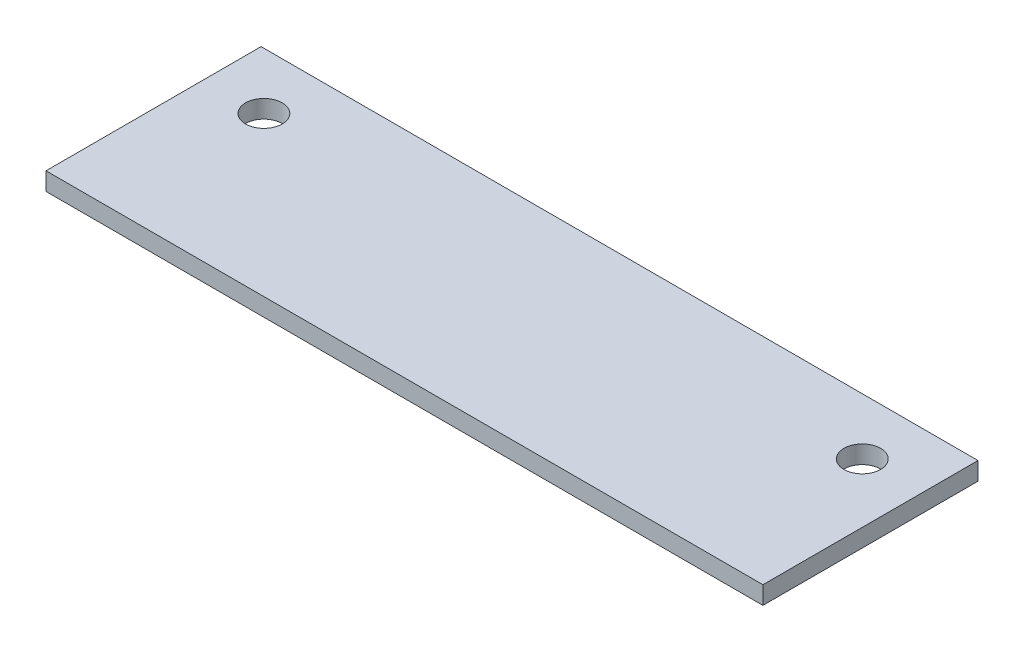
ISO-10303-21;
HEADER;
FILE_DESCRIPTION(('STEP AP214'),'2;1');
FILE_NAME('part.step','',(''),(''),'','','');
FILE_SCHEMA(('AUTOMOTIVE_DESIGN { 1 0 10303 214 1 1 1 1 }'));
ENDSEC;
DATA;
#1=APPLICATION_CONTEXT('core data for automotive mechanical design processes');
#2=APPLICATION_PROTOCOL_DEFINITION('international standard','automotive_design',2000,#1);
#3=PRODUCT_CONTEXT('',#1,'mechanical');
#4=PRODUCT('Part','Part','',(#3));
#5=PRODUCT_RELATED_PRODUCT_CATEGORY('part','',(#4));
#6=PRODUCT_DEFINITION_FORMATION('','',#4);
#7=PRODUCT_DEFINITION_CONTEXT('part definition',#1,'design');
#8=PRODUCT_DEFINITION('design','',#6,#7);
#9=PRODUCT_DEFINITION_SHAPE('','',#8);
#10=(LENGTH_UNIT() NAMED_UNIT(*) SI_UNIT(.MILLI.,.METRE.));
#11=(NAMED_UNIT(*) PLANE_ANGLE_UNIT() SI_UNIT($,.RADIAN.));
#12=(NAMED_UNIT(*) SI_UNIT($,.STERADIAN.) SOLID_ANGLE_UNIT());
#13=UNCERTAINTY_MEASURE_WITH_UNIT(LENGTH_MEASURE(1.E-05),#10,'distance_accuracy_value','');
#14=(GEOMETRIC_REPRESENTATION_CONTEXT(3) GLOBAL_UNCERTAINTY_ASSIGNED_CONTEXT((#13)) GLOBAL_UNIT_ASSIGNED_CONTEXT((#10,
#11,#12)) REPRESENTATION_CONTEXT('',''));
#15=CARTESIAN_POINT('',(0.,0.,0.));
#16=DIRECTION('',(0.,0.,1.));
#17=DIRECTION('',(1.,0.,0.));
#18=AXIS2_PLACEMENT_3D('',#15,#16,#17);
#19=CARTESIAN_POINT('',(-63.5,3.175,38.1));
#20=DIRECTION('',(-1.,0.,0.));
#21=DIRECTION('',(0.,0.,1.));
#22=AXIS2_PLACEMENT_3D('',#19,#20,#21);
#23=PLANE('',#22);
#24=DIRECTION('',(0.,1.,0.));
#25=VECTOR('',#24,1.);
#26=CARTESIAN_POINT('',(-63.5,0.,0.));
#27=LINE('',#26,#25);
#28=CARTESIAN_POINT('',(-63.5,0.,0.));
#29=VERTEX_POINT('',#28);
#30=CARTESIAN_POINT('',(-63.5,3.175,0.));
#31=VERTEX_POINT('',#30);
#32=EDGE_CURVE('E48',#29,#31,#27,.T.);
#33=ORIENTED_EDGE('',*,*,#32,.T.);
#34=DIRECTION('',(0.,0.,-1.));
#35=VECTOR('',#34,1.);
#36=CARTESIAN_POINT('',(-63.5,3.175,38.1));
#37=LINE('',#36,#35);
#38=CARTESIAN_POINT('',(-63.5,3.175,-38.1));
#39=VERTEX_POINT('',#38);
#40=EDGE_CURVE('E78',#31,#39,#37,.T.);
#41=ORIENTED_EDGE('',*,*,#40,.T.);
#42=DIRECTION('',(0.,-1.,0.));
#43=VECTOR('',#42,1.);
#44=CARTESIAN_POINT('',(-63.5,3.175,-38.1));
#45=LINE('',#44,#43);
#46=CARTESIAN_POINT('',(-63.5,0.,-38.1));
#47=VERTEX_POINT('',#46);
#48=EDGE_CURVE('E37',#39,#47,#45,.T.);
#49=ORIENTED_EDGE('',*,*,#48,.T.);
#50=DIRECTION('',(0.,0.,-1.));
#51=VECTOR('',#50,1.);
#52=CARTESIAN_POINT('',(-63.5,0.,38.1));
#53=LINE('',#52,#51);
#54=EDGE_CURVE('E89',#29,#47,#53,.T.);
#55=ORIENTED_EDGE('',*,*,#54,.F.);
#56=EDGE_LOOP('',(#33,#41,#49,#55));
#57=FACE_BOUND('',#56,.T.);
#58=ADVANCED_FACE('F34',(#57),#23,.T.);
#59=CARTESIAN_POINT('',(63.5,3.175,38.1));
#60=DIRECTION('',(-1.,0.,0.));
#61=DIRECTION('',(0.,0.,1.));
#62=AXIS2_PLACEMENT_3D('',#59,#60,#61);
#63=PLANE('',#62);
#64=DIRECTION('',(0.,0.,-1.));
#65=VECTOR('',#64,1.);
#66=CARTESIAN_POINT('',(63.5,3.175,38.1));
#67=LINE('',#66,#65);
#68=CARTESIAN_POINT('',(63.5,3.175,0.));
#69=VERTEX_POINT('',#68);
#70=CARTESIAN_POINT('',(63.5,3.175,-38.1));
#71=VERTEX_POINT('',#70);
#72=EDGE_CURVE('E57',#69,#71,#67,.T.);
#73=ORIENTED_EDGE('',*,*,#72,.F.);
#74=DIRECTION('',(0.,1.,0.));
#75=VECTOR('',#74,1.);
#76=CARTESIAN_POINT('',(63.5,0.,0.));
#77=LINE('',#76,#75);
#78=CARTESIAN_POINT('',(63.5,0.,0.));
#79=VERTEX_POINT('',#78);
#80=EDGE_CURVE('E75',#79,#69,#77,.T.);
#81=ORIENTED_EDGE('',*,*,#80,.F.);
#82=DIRECTION('',(0.,0.,-1.));
#83=VECTOR('',#82,1.);
#84=CARTESIAN_POINT('',(63.5,0.,38.1));
#85=LINE('',#84,#83);
#86=CARTESIAN_POINT('',(63.5,0.,-38.1));
#87=VERTEX_POINT('',#86);
#88=EDGE_CURVE('E71',#79,#87,#85,.T.);
#89=ORIENTED_EDGE('',*,*,#88,.T.);
#90=DIRECTION('',(0.,-1.,0.));
#91=VECTOR('',#90,1.);
#92=CARTESIAN_POINT('',(63.5,3.175,-38.1));
#93=LINE('',#92,#91);
#94=EDGE_CURVE('E11',#71,#87,#93,.T.);
#95=ORIENTED_EDGE('',*,*,#94,.F.);
#96=EDGE_LOOP('',(#73,#81,#89,#95));
#97=FACE_BOUND('',#96,.T.);
#98=ADVANCED_FACE('F72',(#97),#63,.F.);
#99=CARTESIAN_POINT('',(-63.5,3.175,-38.1));
#100=DIRECTION('',(0.,0.,-1.));
#101=DIRECTION('',(-1.,0.,0.));
#102=AXIS2_PLACEMENT_3D('',#99,#100,#101);
#103=PLANE('',#102);
#104=DIRECTION('',(1.,0.,0.));
#105=VECTOR('',#104,1.);
#106=CARTESIAN_POINT('',(-63.5,0.,-38.1));
#107=LINE('',#106,#105);
#108=EDGE_CURVE('E79',#47,#87,#107,.T.);
#109=ORIENTED_EDGE('',*,*,#108,.F.);
#110=ORIENTED_EDGE('',*,*,#48,.F.);
#111=DIRECTION('',(1.,0.,0.));
#112=VECTOR('',#111,1.);
#113=CARTESIAN_POINT('',(-63.5,3.175,-38.1));
#114=LINE('',#113,#112);
#115=EDGE_CURVE('E85',#39,#71,#114,.T.);
#116=ORIENTED_EDGE('',*,*,#115,.T.);
#117=ORIENTED_EDGE('',*,*,#94,.T.);
#118=EDGE_LOOP('',(#109,#110,#116,#117));
#119=FACE_BOUND('',#118,.T.);
#120=ADVANCED_FACE('F83',(#119),#103,.T.);
#121=CARTESIAN_POINT('',(0.,3.175,0.));
#122=DIRECTION('',(0.,-1.,0.));
#123=DIRECTION('',(0.,0.,-1.));
#124=AXIS2_PLACEMENT_3D('',#121,#122,#123);
#125=PLANE('',#124);
#126=CARTESIAN_POINT('',(-53.,3.175,-28.1));
#127=DIRECTION('',(0.,1.,0.));
#128=DIRECTION('',(0.,0.,1.));
#129=AXIS2_PLACEMENT_3D('',#126,#127,#128);
#130=CIRCLE('',#129,3.24999999999995);
#131=CARTESIAN_POINT('',(-53.,3.175,-24.85));
#132=VERTEX_POINT('',#131);
#133=EDGE_CURVE('E103',#132,#132,#130,.T.);
#134=ORIENTED_EDGE('',*,*,#133,.F.);
#135=EDGE_LOOP('',(#134));
#136=FACE_BOUND('',#135,.T.);
#137=CARTESIAN_POINT('',(53.0000000000001,3.175,-28.1));
#138=DIRECTION('',(0.,1.,0.));
#139=DIRECTION('',(0.,0.,1.));
#140=AXIS2_PLACEMENT_3D('',#137,#138,#139);
#141=CIRCLE('',#140,3.24999999999995);
#142=CARTESIAN_POINT('',(53.0000000000001,3.175,-24.85));
#143=VERTEX_POINT('',#142);
#144=EDGE_CURVE('E97',#143,#143,#141,.T.);
#145=ORIENTED_EDGE('',*,*,#144,.F.);
#146=EDGE_LOOP('',(#145));
#147=FACE_BOUND('',#146,.T.);
#148=ORIENTED_EDGE('',*,*,#40,.F.);
#149=DIRECTION('',(-1.,0.,0.));
#150=VECTOR('',#149,1.);
#151=CARTESIAN_POINT('',(0.,3.175,0.));
#152=LINE('',#151,#150);
#153=EDGE_CURVE('E109',#69,#31,#152,.T.);
#154=ORIENTED_EDGE('',*,*,#153,.F.);
#155=ORIENTED_EDGE('',*,*,#72,.T.);
#156=ORIENTED_EDGE('',*,*,#115,.F.);
#157=EDGE_LOOP('',(#148,#154,#155,#156));
#158=FACE_BOUND('',#157,.T.);
#159=ADVANCED_FACE('F117',(#136,#147,#158),#125,.F.);
#160=CARTESIAN_POINT('',(0.,0.,0.));
#161=DIRECTION('',(0.,-1.,0.));
#162=DIRECTION('',(0.,0.,-1.));
#163=AXIS2_PLACEMENT_3D('',#160,#161,#162);
#164=PLANE('',#163);
#165=DIRECTION('',(-1.,0.,0.));
#166=VECTOR('',#165,1.);
#167=CARTESIAN_POINT('',(0.,0.,0.));
#168=LINE('',#167,#166);
#169=EDGE_CURVE('E111',#79,#29,#168,.T.);
#170=ORIENTED_EDGE('',*,*,#169,.T.);
#171=ORIENTED_EDGE('',*,*,#54,.T.);
#172=ORIENTED_EDGE('',*,*,#108,.T.);
#173=ORIENTED_EDGE('',*,*,#88,.F.);
#174=EDGE_LOOP('',(#170,#171,#172,#173));
#175=FACE_BOUND('',#174,.T.);
#176=CARTESIAN_POINT('',(-53.,0.,-28.1));
#177=DIRECTION('',(0.,1.,0.));
#178=DIRECTION('',(0.,0.,1.));
#179=AXIS2_PLACEMENT_3D('',#176,#177,#178);
#180=CIRCLE('',#179,3.24999999999995);
#181=CARTESIAN_POINT('',(-53.,0.,-24.85));
#182=VERTEX_POINT('',#181);
#183=EDGE_CURVE('E106',#182,#182,#180,.T.);
#184=ORIENTED_EDGE('',*,*,#183,.T.);
#185=EDGE_LOOP('',(#184));
#186=FACE_BOUND('',#185,.T.);
#187=CARTESIAN_POINT('',(53.0000000000001,0.,-28.1));
#188=DIRECTION('',(0.,1.,0.));
#189=DIRECTION('',(0.,0.,1.));
#190=AXIS2_PLACEMENT_3D('',#187,#188,#189);
#191=CIRCLE('',#190,3.24999999999995);
#192=CARTESIAN_POINT('',(53.0000000000001,0.,-24.85));
#193=VERTEX_POINT('',#192);
#194=EDGE_CURVE('E100',#193,#193,#191,.T.);
#195=ORIENTED_EDGE('',*,*,#194,.T.);
#196=EDGE_LOOP('',(#195));
#197=FACE_BOUND('',#196,.T.);
#198=ADVANCED_FACE('F86',(#175,#186,#197),#164,.T.);
#199=CARTESIAN_POINT('',(53.0000000000001,0.,-28.1));
#200=DIRECTION('',(0.,1.,0.));
#201=DIRECTION('',(0.,0.,1.));
#202=AXIS2_PLACEMENT_3D('',#199,#200,#201);
#203=CYLINDRICAL_SURFACE('',#202,3.24999999999995);
#204=ORIENTED_EDGE('',*,*,#194,.F.);
#205=EDGE_LOOP('',(#204));
#206=FACE_BOUND('',#205,.T.);
#207=ORIENTED_EDGE('',*,*,#144,.T.);
#208=EDGE_LOOP('',(#207));
#209=FACE_BOUND('',#208,.T.);
#210=ADVANCED_FACE('F128',(#206,#209),#203,.F.);
#211=CARTESIAN_POINT('',(-53.,0.,-28.1));
#212=DIRECTION('',(0.,1.,0.));
#213=DIRECTION('',(0.,0.,1.));
#214=AXIS2_PLACEMENT_3D('',#211,#212,#213);
#215=CYLINDRICAL_SURFACE('',#214,3.24999999999995);
#216=ORIENTED_EDGE('',*,*,#183,.F.);
#217=EDGE_LOOP('',(#216));
#218=FACE_BOUND('',#217,.T.);
#219=ORIENTED_EDGE('',*,*,#133,.T.);
#220=EDGE_LOOP('',(#219));
#221=FACE_BOUND('',#220,.T.);
#222=ADVANCED_FACE('F123',(#218,#221),#215,.F.);
#223=CARTESIAN_POINT('',(0.,0.,0.));
#224=DIRECTION('',(0.,0.,-1.));
#225=DIRECTION('',(-1.,0.,0.));
#226=AXIS2_PLACEMENT_3D('',#223,#224,#225);
#227=PLANE('',#226);
#228=ORIENTED_EDGE('',*,*,#153,.T.);
#229=ORIENTED_EDGE('',*,*,#32,.F.);
#230=ORIENTED_EDGE('',*,*,#169,.F.);
#231=ORIENTED_EDGE('',*,*,#80,.T.);
#232=EDGE_LOOP('',(#228,#229,#230,#231));
#233=FACE_BOUND('',#232,.T.);
#234=ADVANCED_FACE('F121',(#233),#227,.F.);
#235=CLOSED_SHELL('',(#58,#98,#120,#159,#198,#210,#222,#234));
#236=MANIFOLD_SOLID_BREP('B2',#235);
#237=ADVANCED_BREP_SHAPE_REPRESENTATION('',(#18,#236),#14);
#238=SHAPE_DEFINITION_REPRESENTATION(#9,#237);
ENDSEC;
END-ISO-10303-21;
